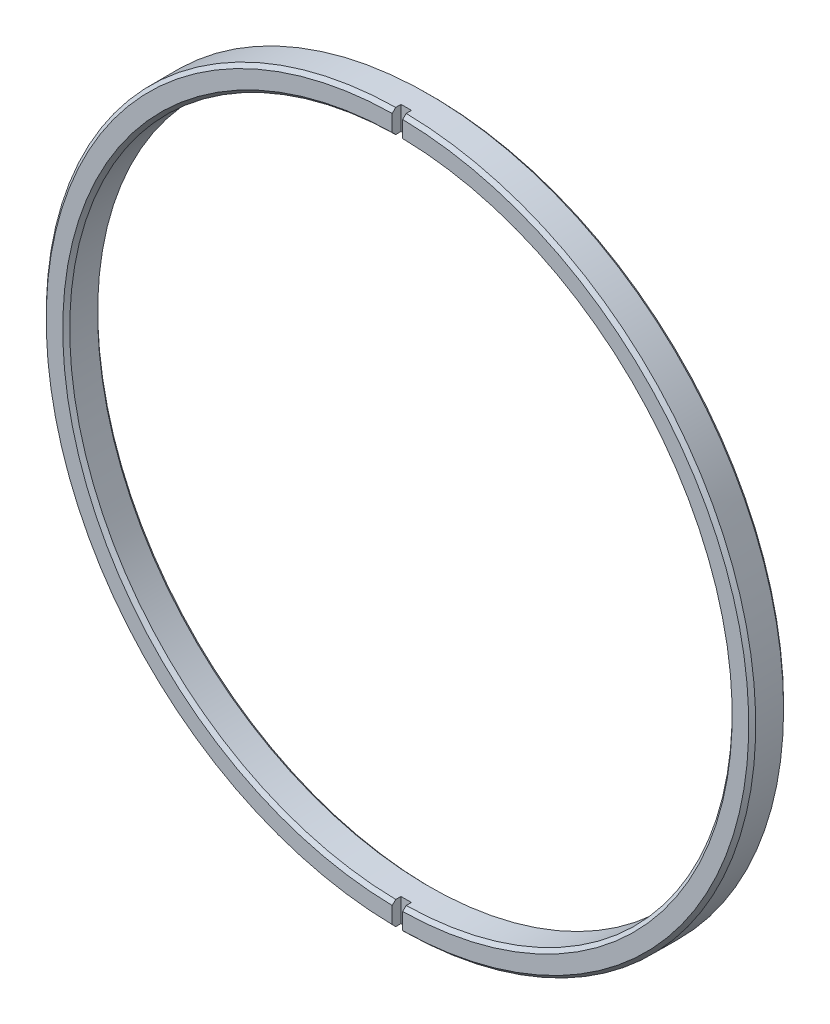
ISO-10303-21;
HEADER;
FILE_DESCRIPTION(('STEP AP214'),'2;1');
FILE_NAME('part.step','',(''),(''),'','','');
FILE_SCHEMA(('AUTOMOTIVE_DESIGN { 1 0 10303 214 1 1 1 1 }'));
ENDSEC;
DATA;
#1=APPLICATION_CONTEXT('core data for automotive mechanical design processes');
#2=APPLICATION_PROTOCOL_DEFINITION('international standard','automotive_design',2000,#1);
#3=PRODUCT_CONTEXT('',#1,'mechanical');
#4=PRODUCT('Part','Part','',(#3));
#5=PRODUCT_RELATED_PRODUCT_CATEGORY('part','',(#4));
#6=PRODUCT_DEFINITION_FORMATION('','',#4);
#7=PRODUCT_DEFINITION_CONTEXT('part definition',#1,'design');
#8=PRODUCT_DEFINITION('design','',#6,#7);
#9=PRODUCT_DEFINITION_SHAPE('','',#8);
#10=(LENGTH_UNIT() NAMED_UNIT(*) SI_UNIT(.MILLI.,.METRE.));
#11=(NAMED_UNIT(*) PLANE_ANGLE_UNIT() SI_UNIT($,.RADIAN.));
#12=(NAMED_UNIT(*) SI_UNIT($,.STERADIAN.) SOLID_ANGLE_UNIT());
#13=UNCERTAINTY_MEASURE_WITH_UNIT(LENGTH_MEASURE(1.E-05),#10,'distance_accuracy_value','');
#14=(GEOMETRIC_REPRESENTATION_CONTEXT(3) GLOBAL_UNCERTAINTY_ASSIGNED_CONTEXT((#13)) GLOBAL_UNIT_ASSIGNED_CONTEXT((#10,
#11,#12)) REPRESENTATION_CONTEXT('',''));
#15=CARTESIAN_POINT('',(0.,0.,0.));
#16=DIRECTION('',(0.,0.,1.));
#17=DIRECTION('',(1.,0.,0.));
#18=AXIS2_PLACEMENT_3D('',#15,#16,#17);
#19=CARTESIAN_POINT('',(-93.4110504351793,-0.249410269873351,50.7311838564651));
#20=DIRECTION('',(0.,0.,1.));
#21=DIRECTION('',(1.,0.,0.));
#22=AXIS2_PLACEMENT_3D('',#19,#20,#21);
#23=PLANE('',#22);
#24=DIRECTION('',(0.,-1.,0.));
#25=VECTOR('',#24,1.);
#26=CARTESIAN_POINT('',(-93.7920504351793,28.4818278532366,50.7311838564651));
#27=LINE('',#26,#25);
#28=CARTESIAN_POINT('',(-93.7920504351793,-24.6304335256762,50.7311838564651));
#29=VERTEX_POINT('',#28);
#30=CARTESIAN_POINT('',(-93.7920504351793,-25.8370738843967,50.7311838564651));
#31=VERTEX_POINT('',#30);
#32=EDGE_CURVE('E270',#29,#31,#27,.T.);
#33=ORIENTED_EDGE('',*,*,#32,.F.);
#34=CARTESIAN_POINT('',(-93.4110504351793,-0.249410269873351,50.7311838564651));
#35=DIRECTION('',(0.,0.,1.));
#36=DIRECTION('',(1.,0.,0.));
#37=AXIS2_PLACEMENT_3D('',#34,#35,#36);
#38=CIRCLE('',#37,24.384);
#39=CARTESIAN_POINT('',(-93.7920504351793,24.1316129859295,50.7311838564651));
#40=VERTEX_POINT('',#39);
#41=EDGE_CURVE('E223',#29,#40,#38,.F.);
#42=ORIENTED_EDGE('',*,*,#41,.T.);
#43=CARTESIAN_POINT('',(-93.7920504351793,25.33825334465,50.7311838564651));
#44=VERTEX_POINT('',#43);
#45=EDGE_CURVE('E269',#44,#40,#27,.T.);
#46=ORIENTED_EDGE('',*,*,#45,.F.);
#47=CARTESIAN_POINT('',(-93.4110504351793,-0.249410269873351,50.7311838564651));
#48=DIRECTION('',(0.,0.,1.));
#49=DIRECTION('',(1.,0.,0.));
#50=AXIS2_PLACEMENT_3D('',#47,#48,#49);
#51=CIRCLE('',#50,25.5905);
#52=EDGE_CURVE('E280',#44,#31,#51,.T.);
#53=ORIENTED_EDGE('',*,*,#52,.T.);
#54=EDGE_LOOP('',(#33,#42,#46,#53));
#55=FACE_BOUND('',#54,.T.);
#56=ADVANCED_FACE('F15',(#55),#23,.T.);
#57=DIRECTION('',(0.,1.,0.));
#58=VECTOR('',#57,1.);
#59=CARTESIAN_POINT('',(-93.0300504351793,28.4818278532366,50.7311838564651));
#60=LINE('',#59,#58);
#61=CARTESIAN_POINT('',(-93.0300504351793,24.1316129859295,50.7311838564651));
#62=VERTEX_POINT('',#61);
#63=CARTESIAN_POINT('',(-93.0300504351793,25.33825334465,50.7311838564651));
#64=VERTEX_POINT('',#63);
#65=EDGE_CURVE('E266',#62,#64,#60,.T.);
#66=ORIENTED_EDGE('',*,*,#65,.F.);
#67=CARTESIAN_POINT('',(-93.4110504351793,-0.249410269873351,50.7311838564651));
#68=DIRECTION('',(0.,0.,1.));
#69=DIRECTION('',(1.,0.,0.));
#70=AXIS2_PLACEMENT_3D('',#67,#68,#69);
#71=CIRCLE('',#70,24.384);
#72=CARTESIAN_POINT('',(-93.0300504351793,-24.6304335256762,50.7311838564651));
#73=VERTEX_POINT('',#72);
#74=EDGE_CURVE('E37',#62,#73,#71,.F.);
#75=ORIENTED_EDGE('',*,*,#74,.T.);
#76=CARTESIAN_POINT('',(-93.0300504351793,-25.8370738843967,50.7311838564651));
#77=VERTEX_POINT('',#76);
#78=EDGE_CURVE('E145',#77,#73,#60,.T.);
#79=ORIENTED_EDGE('',*,*,#78,.F.);
#80=CARTESIAN_POINT('',(-93.4110504351793,-0.249410269873351,50.7311838564651));
#81=DIRECTION('',(0.,0.,1.));
#82=DIRECTION('',(1.,0.,0.));
#83=AXIS2_PLACEMENT_3D('',#80,#81,#82);
#84=CIRCLE('',#83,25.5905);
#85=EDGE_CURVE('E256',#77,#64,#84,.T.);
#86=ORIENTED_EDGE('',*,*,#85,.T.);
#87=EDGE_LOOP('',(#66,#75,#79,#86));
#88=FACE_BOUND('',#87,.T.);
#89=ADVANCED_FACE('F265',(#88),#23,.T.);
#90=CARTESIAN_POINT('',(-93.4110504351793,-0.249410269873351,48.1911838564651));
#91=DIRECTION('',(0.,0.,1.));
#92=DIRECTION('',(1.,0.,0.));
#93=AXIS2_PLACEMENT_3D('',#90,#91,#92);
#94=PLANE('',#93);
#95=CARTESIAN_POINT('',(-93.4110504351793,-0.249410269873351,48.1911838564651));
#96=DIRECTION('',(0.,0.,1.));
#97=DIRECTION('',(1.,0.,0.));
#98=AXIS2_PLACEMENT_3D('',#95,#96,#97);
#99=CIRCLE('',#98,24.384);
#100=CARTESIAN_POINT('',(-69.0270504351793,-0.249410269873351,48.1911838564651));
#101=VERTEX_POINT('',#100);
#102=EDGE_CURVE('E169',#101,#101,#99,.T.);
#103=ORIENTED_EDGE('',*,*,#102,.T.);
#104=EDGE_LOOP('',(#103));
#105=FACE_BOUND('',#104,.T.);
#106=CARTESIAN_POINT('',(-93.4110504351793,-0.249410269873351,48.1911838564651));
#107=DIRECTION('',(0.,0.,1.));
#108=DIRECTION('',(1.,0.,0.));
#109=AXIS2_PLACEMENT_3D('',#106,#107,#108);
#110=CIRCLE('',#109,25.5905);
#111=CARTESIAN_POINT('',(-67.8205504351793,-0.249410269873351,48.1911838564651));
#112=VERTEX_POINT('',#111);
#113=EDGE_CURVE('E166',#112,#112,#110,.F.);
#114=ORIENTED_EDGE('',*,*,#113,.T.);
#115=EDGE_LOOP('',(#114));
#116=FACE_BOUND('',#115,.T.);
#117=ADVANCED_FACE('F297',(#105,#116),#94,.F.);
#118=CARTESIAN_POINT('',(-93.4110504351793,-0.249410269873351,50.7311838564651));
#119=DIRECTION('',(0.,0.,-1.));
#120=DIRECTION('',(-1.,0.,0.));
#121=AXIS2_PLACEMENT_3D('',#118,#119,#120);
#122=CYLINDRICAL_SURFACE('',#121,25.8445);
#123=CARTESIAN_POINT('',(-93.4110504351793,-0.249410269873351,48.4451838564651));
#124=DIRECTION('',(0.,0.,1.));
#125=DIRECTION('',(1.,0.,0.));
#126=AXIS2_PLACEMENT_3D('',#123,#124,#125);
#127=CIRCLE('',#126,25.8445);
#128=CARTESIAN_POINT('',(-67.5665504351793,-0.249410269873351,48.4451838564651));
#129=VERTEX_POINT('',#128);
#130=EDGE_CURVE('E184',#129,#129,#127,.T.);
#131=ORIENTED_EDGE('',*,*,#130,.T.);
#132=EDGE_LOOP('',(#131));
#133=FACE_BOUND('',#132,.T.);
#134=DIRECTION('',(0.,0.,-1.));
#135=VECTOR('',#134,1.);
#136=CARTESIAN_POINT('',(-93.0300504351793,25.5922812237189,50.7311838564651));
#137=LINE('',#136,#135);
#138=CARTESIAN_POINT('',(-93.0300504351793,25.5922812237189,50.0961838564651));
#139=VERTEX_POINT('',#138);
#140=CARTESIAN_POINT('',(-93.0300504351793,25.5922812237189,50.4771838564652));
#141=VERTEX_POINT('',#140);
#142=EDGE_CURVE('E133',#139,#141,#137,.F.);
#143=ORIENTED_EDGE('',*,*,#142,.T.);
#144=CARTESIAN_POINT('',(-93.4110504351793,-0.249410269873351,50.4771838564652));
#145=DIRECTION('',(0.,0.,1.));
#146=DIRECTION('',(1.,0.,0.));
#147=AXIS2_PLACEMENT_3D('',#144,#145,#146);
#148=CIRCLE('',#147,25.8445);
#149=CARTESIAN_POINT('',(-93.0300504351793,-26.0911017634656,50.4771838564652));
#150=VERTEX_POINT('',#149);
#151=EDGE_CURVE('E182',#141,#150,#148,.F.);
#152=ORIENTED_EDGE('',*,*,#151,.T.);
#153=DIRECTION('',(0.,0.,-1.));
#154=VECTOR('',#153,1.);
#155=CARTESIAN_POINT('',(-93.0300504351793,-26.0911017634656,50.7311838564651));
#156=LINE('',#155,#154);
#157=CARTESIAN_POINT('',(-93.0300504351793,-26.0911017634656,50.0961838564651));
#158=VERTEX_POINT('',#157);
#159=EDGE_CURVE('E151',#150,#158,#156,.T.);
#160=ORIENTED_EDGE('',*,*,#159,.T.);
#161=CARTESIAN_POINT('',(-93.4110504351793,-0.249410269873351,50.0961838564651));
#162=DIRECTION('',(0.,0.,1.));
#163=DIRECTION('',(1.,0.,0.));
#164=AXIS2_PLACEMENT_3D('',#161,#162,#163);
#165=CIRCLE('',#164,25.8445);
#166=CARTESIAN_POINT('',(-93.7920504351793,-26.0911017634656,50.0961838564651));
#167=VERTEX_POINT('',#166);
#168=EDGE_CURVE('E134',#167,#158,#165,.T.);
#169=ORIENTED_EDGE('',*,*,#168,.F.);
#170=DIRECTION('',(0.,0.,-1.));
#171=VECTOR('',#170,1.);
#172=CARTESIAN_POINT('',(-93.7920504351793,-26.0911017634656,50.7311838564651));
#173=LINE('',#172,#171);
#174=CARTESIAN_POINT('',(-93.7920504351793,-26.0911017634656,50.4771838564652));
#175=VERTEX_POINT('',#174);
#176=EDGE_CURVE('E123',#167,#175,#173,.F.);
#177=ORIENTED_EDGE('',*,*,#176,.T.);
#178=CARTESIAN_POINT('',(-93.4110504351793,-0.249410269873351,50.4771838564652));
#179=DIRECTION('',(0.,0.,1.));
#180=DIRECTION('',(1.,0.,0.));
#181=AXIS2_PLACEMENT_3D('',#178,#179,#180);
#182=CIRCLE('',#181,25.8445);
#183=CARTESIAN_POINT('',(-93.7920504351793,25.5922812237189,50.4771838564652));
#184=VERTEX_POINT('',#183);
#185=EDGE_CURVE('E118',#175,#184,#182,.F.);
#186=ORIENTED_EDGE('',*,*,#185,.T.);
#187=DIRECTION('',(0.,0.,-1.));
#188=VECTOR('',#187,1.);
#189=CARTESIAN_POINT('',(-93.7920504351793,25.5922812237189,50.7311838564651));
#190=LINE('',#189,#188);
#191=CARTESIAN_POINT('',(-93.7920504351793,25.5922812237189,50.0961838564651));
#192=VERTEX_POINT('',#191);
#193=EDGE_CURVE('E111',#184,#192,#190,.T.);
#194=ORIENTED_EDGE('',*,*,#193,.T.);
#195=EDGE_CURVE('E115',#139,#192,#165,.T.);
#196=ORIENTED_EDGE('',*,*,#195,.F.);
#197=EDGE_LOOP('',(#143,#152,#160,#169,#177,#186,#194,#196));
#198=FACE_BOUND('',#197,.T.);
#199=ADVANCED_FACE('F114',(#133,#198),#122,.T.);
#200=CARTESIAN_POINT('',(-93.4110504351793,-0.249410269873351,50.7311838564651));
#201=DIRECTION('',(0.,0.,-1.));
#202=DIRECTION('',(-1.,0.,0.));
#203=AXIS2_PLACEMENT_3D('',#200,#201,#202);
#204=CYLINDRICAL_SURFACE('',#203,24.13);
#205=CARTESIAN_POINT('',(-93.4110504351793,-0.249410269873351,48.4451838564651));
#206=DIRECTION('',(0.,0.,1.));
#207=DIRECTION('',(1.,0.,0.));
#208=AXIS2_PLACEMENT_3D('',#205,#206,#207);
#209=CIRCLE('',#208,24.13);
#210=CARTESIAN_POINT('',(-69.2810504351793,-0.249410269873351,48.4451838564651));
#211=VERTEX_POINT('',#210);
#212=EDGE_CURVE('E178',#211,#211,#209,.F.);
#213=ORIENTED_EDGE('',*,*,#212,.T.);
#214=EDGE_LOOP('',(#213));
#215=FACE_BOUND('',#214,.T.);
#216=DIRECTION('',(0.,0.,-1.));
#217=VECTOR('',#216,1.);
#218=CARTESIAN_POINT('',(-93.7920504351793,23.8775816478938,50.7311838564651));
#219=LINE('',#218,#217);
#220=CARTESIAN_POINT('',(-93.7920504351793,23.8775816478938,50.4771838564651));
#221=VERTEX_POINT('',#220);
#222=CARTESIAN_POINT('',(-93.7920504351793,23.8775816478938,50.0961838564651));
#223=VERTEX_POINT('',#222);
#224=EDGE_CURVE('E139',#221,#223,#219,.T.);
#225=ORIENTED_EDGE('',*,*,#224,.F.);
#226=CARTESIAN_POINT('',(-93.4110504351793,-0.249410269873351,50.4771838564651));
#227=DIRECTION('',(0.,0.,1.));
#228=DIRECTION('',(1.,0.,0.));
#229=AXIS2_PLACEMENT_3D('',#226,#227,#228);
#230=CIRCLE('',#229,24.13);
#231=CARTESIAN_POINT('',(-93.7920504351793,-24.3764021876405,50.4771838564651));
#232=VERTEX_POINT('',#231);
#233=EDGE_CURVE('E175',#221,#232,#230,.T.);
#234=ORIENTED_EDGE('',*,*,#233,.T.);
#235=DIRECTION('',(0.,0.,-1.));
#236=VECTOR('',#235,1.);
#237=CARTESIAN_POINT('',(-93.7920504351793,-24.3764021876405,50.7311838564651));
#238=LINE('',#237,#236);
#239=CARTESIAN_POINT('',(-93.7920504351793,-24.3764021876405,50.0961838564651));
#240=VERTEX_POINT('',#239);
#241=EDGE_CURVE('E159',#240,#232,#238,.F.);
#242=ORIENTED_EDGE('',*,*,#241,.F.);
#243=CARTESIAN_POINT('',(-93.4110504351793,-0.249410269873351,50.0961838564651));
#244=DIRECTION('',(0.,0.,1.));
#245=DIRECTION('',(1.,0.,0.));
#246=AXIS2_PLACEMENT_3D('',#243,#244,#245);
#247=CIRCLE('',#246,24.13);
#248=CARTESIAN_POINT('',(-93.0300504351793,-24.3764021876405,50.0961838564651));
#249=VERTEX_POINT('',#248);
#250=EDGE_CURVE('E122',#240,#249,#247,.T.);
#251=ORIENTED_EDGE('',*,*,#250,.T.);
#252=DIRECTION('',(0.,0.,-1.));
#253=VECTOR('',#252,1.);
#254=CARTESIAN_POINT('',(-93.0300504351793,-24.3764021876405,50.7311838564651));
#255=LINE('',#254,#253);
#256=CARTESIAN_POINT('',(-93.0300504351793,-24.3764021876405,50.4771838564651));
#257=VERTEX_POINT('',#256);
#258=EDGE_CURVE('E156',#257,#249,#255,.T.);
#259=ORIENTED_EDGE('',*,*,#258,.F.);
#260=CARTESIAN_POINT('',(-93.4110504351793,-0.249410269873351,50.4771838564651));
#261=DIRECTION('',(0.,0.,1.));
#262=DIRECTION('',(1.,0.,0.));
#263=AXIS2_PLACEMENT_3D('',#260,#261,#262);
#264=CIRCLE('',#263,24.13);
#265=CARTESIAN_POINT('',(-93.0300504351793,23.8775816478938,50.4771838564651));
#266=VERTEX_POINT('',#265);
#267=EDGE_CURVE('E172',#257,#266,#264,.T.);
#268=ORIENTED_EDGE('',*,*,#267,.T.);
#269=DIRECTION('',(0.,0.,-1.));
#270=VECTOR('',#269,1.);
#271=CARTESIAN_POINT('',(-93.0300504351793,23.8775816478938,50.7311838564651));
#272=LINE('',#271,#270);
#273=CARTESIAN_POINT('',(-93.0300504351793,23.8775816478938,50.0961838564651));
#274=VERTEX_POINT('',#273);
#275=EDGE_CURVE('E162',#274,#266,#272,.F.);
#276=ORIENTED_EDGE('',*,*,#275,.F.);
#277=EDGE_CURVE('E157',#274,#223,#247,.T.);
#278=ORIENTED_EDGE('',*,*,#277,.T.);
#279=EDGE_LOOP('',(#225,#234,#242,#251,#259,#268,#276,#278));
#280=FACE_BOUND('',#279,.T.);
#281=ADVANCED_FACE('F209',(#215,#280),#204,.F.);
#282=CARTESIAN_POINT('',(-93.7920504351793,-30.2378711679971,50.0961838564651));
#283=DIRECTION('',(0.,0.,1.));
#284=DIRECTION('',(1.,0.,0.));
#285=AXIS2_PLACEMENT_3D('',#282,#283,#284);
#286=PLANE('',#285);
#287=ORIENTED_EDGE('',*,*,#168,.T.);
#288=DIRECTION('',(0.,1.,0.));
#289=VECTOR('',#288,1.);
#290=CARTESIAN_POINT('',(-93.0300504351793,28.4818278532366,50.0961838564651));
#291=LINE('',#290,#289);
#292=EDGE_CURVE('E142',#158,#249,#291,.T.);
#293=ORIENTED_EDGE('',*,*,#292,.T.);
#294=ORIENTED_EDGE('',*,*,#250,.F.);
#295=DIRECTION('',(0.,-1.,0.));
#296=VECTOR('',#295,1.);
#297=CARTESIAN_POINT('',(-93.7920504351793,28.4818278532366,50.0961838564651));
#298=LINE('',#297,#296);
#299=EDGE_CURVE('E140',#240,#167,#298,.T.);
#300=ORIENTED_EDGE('',*,*,#299,.T.);
#301=EDGE_LOOP('',(#287,#293,#294,#300));
#302=FACE_BOUND('',#301,.T.);
#303=ADVANCED_FACE('F309',(#302),#286,.T.);
#304=CARTESIAN_POINT('',(-93.0300504351793,28.4818278532366,50.0961838564651));
#305=DIRECTION('',(1.,0.,0.));
#306=DIRECTION('',(0.,1.,0.));
#307=AXIS2_PLACEMENT_3D('',#304,#305,#306);
#308=PLANE('',#307);
#309=ORIENTED_EDGE('',*,*,#78,.T.);
#310=CARTESIAN_POINT('',(-93.0300504351793,-24.6304335256762,50.7311838564651));
#311=CARTESIAN_POINT('',(-93.0300504351793,-24.5880949966842,50.6888504957812));
#312=CARTESIAN_POINT('',(-93.0300504351793,-24.5457564540185,50.6465171487725));
#313=CARTESIAN_POINT('',(-93.0300504351793,-24.46107934134,50.5618504821058));
#314=CARTESIAN_POINT('',(-93.0300504351793,-24.418740771327,50.5195171624478));
#315=CARTESIAN_POINT('',(-93.0300504351793,-24.3764021876405,50.4771838564651));
#316=B_SPLINE_CURVE_WITH_KNOTS('',3,(#310,#311,#312,#313,#314,#315),.UNSPECIFIED.,.F.,.F.,(4,2,
4),(0.,0.179616202431916,0.359232404863831),.UNSPECIFIED.);
#317=EDGE_CURVE('E10',#73,#257,#316,.T.);
#318=ORIENTED_EDGE('',*,*,#317,.T.);
#319=ORIENTED_EDGE('',*,*,#258,.T.);
#320=ORIENTED_EDGE('',*,*,#292,.F.);
#321=ORIENTED_EDGE('',*,*,#159,.F.);
#322=CARTESIAN_POINT('',(-93.0300504351793,-26.0911017634656,50.4771838564652));
#323=CARTESIAN_POINT('',(-93.0300504351793,-26.0487638065678,50.519517212748));
#324=CARTESIAN_POINT('',(-93.0300504351793,-26.0064258381965,50.5618505575561));
#325=CARTESIAN_POINT('',(-93.0300504351793,-25.9217498785068,50.6465172242227));
#326=CARTESIAN_POINT('',(-93.0300504351793,-25.8794118871885,50.6888505460813));
#327=CARTESIAN_POINT('',(-93.0300504351793,-25.8370738843967,50.7311838564651));
#328=B_SPLINE_CURVE_WITH_KNOTS('',3,(#322,#323,#324,#325,#326,#327),.UNSPECIFIED.,.F.,.F.,(4,2,
4),(0.,0.179614979431201,0.359229958862404),.UNSPECIFIED.);
#329=EDGE_CURVE('E30',#150,#77,#328,.T.);
#330=ORIENTED_EDGE('',*,*,#329,.T.);
#331=EDGE_LOOP('',(#309,#318,#319,#320,#321,#330));
#332=FACE_BOUND('',#331,.T.);
#333=ADVANCED_FACE('F206',(#332),#308,.F.);
#334=CARTESIAN_POINT('',(-93.7920504351793,28.4818278532366,50.0961838564651));
#335=DIRECTION('',(-1.,0.,0.));
#336=DIRECTION('',(0.,-1.,0.));
#337=AXIS2_PLACEMENT_3D('',#334,#335,#336);
#338=PLANE('',#337);
#339=ORIENTED_EDGE('',*,*,#241,.T.);
#340=CARTESIAN_POINT('',(-93.7920504351793,-24.3764021876405,50.4771838564651));
#341=CARTESIAN_POINT('',(-93.7920504351793,-24.418740771327,50.5195171624478));
#342=CARTESIAN_POINT('',(-93.7920504351793,-24.46107934134,50.5618504821058));
#343=CARTESIAN_POINT('',(-93.7920504351793,-24.5457564540185,50.6465171487725));
#344=CARTESIAN_POINT('',(-93.7920504351793,-24.5880949966842,50.6888504957812));
#345=CARTESIAN_POINT('',(-93.7920504351793,-24.6304335256762,50.7311838564651));
#346=B_SPLINE_CURVE_WITH_KNOTS('',3,(#340,#341,#342,#343,#344,#345),.UNSPECIFIED.,.F.,.F.,(4,2,
4),(0.,0.179616202431912,0.359232404863828),.UNSPECIFIED.);
#347=EDGE_CURVE('E194',#232,#29,#346,.T.);
#348=ORIENTED_EDGE('',*,*,#347,.T.);
#349=ORIENTED_EDGE('',*,*,#32,.T.);
#350=CARTESIAN_POINT('',(-93.7920504351793,-25.8370738843967,50.7311838564651));
#351=CARTESIAN_POINT('',(-93.7920504351793,-25.8794118871885,50.6888505460813));
#352=CARTESIAN_POINT('',(-93.7920504351793,-25.9217498785068,50.6465172242227));
#353=CARTESIAN_POINT('',(-93.7920504351793,-26.0064258381965,50.5618505575561));
#354=CARTESIAN_POINT('',(-93.7920504351793,-26.0487638065678,50.519517212748));
#355=CARTESIAN_POINT('',(-93.7920504351793,-26.0911017634656,50.4771838564652));
#356=B_SPLINE_CURVE_WITH_KNOTS('',3,(#350,#351,#352,#353,#354,#355),.UNSPECIFIED.,.F.,.F.,(4,2,
4),(0.,0.179614979431203,0.359229958862401),.UNSPECIFIED.);
#357=EDGE_CURVE('E187',#31,#175,#356,.T.);
#358=ORIENTED_EDGE('',*,*,#357,.T.);
#359=ORIENTED_EDGE('',*,*,#176,.F.);
#360=ORIENTED_EDGE('',*,*,#299,.F.);
#361=EDGE_LOOP('',(#339,#348,#349,#358,#359,#360));
#362=FACE_BOUND('',#361,.T.);
#363=ADVANCED_FACE('F205',(#362),#338,.F.);
#364=ORIENTED_EDGE('',*,*,#45,.T.);
#365=CARTESIAN_POINT('',(-93.7920504351793,24.1316129859295,50.7311838564651));
#366=CARTESIAN_POINT('',(-93.7920504351793,24.0892744569375,50.6888504957812));
#367=CARTESIAN_POINT('',(-93.7920504351793,24.0469359142718,50.6465171487725));
#368=CARTESIAN_POINT('',(-93.7920504351793,23.9622588015933,50.5618504821058));
#369=CARTESIAN_POINT('',(-93.7920504351793,23.9199202315803,50.5195171624478));
#370=CARTESIAN_POINT('',(-93.7920504351793,23.8775816478938,50.4771838564651));
#371=B_SPLINE_CURVE_WITH_KNOTS('',3,(#365,#366,#367,#368,#369,#370),.UNSPECIFIED.,.F.,.F.,(4,2,
4),(0.,0.179616202431916,0.359232404863831),.UNSPECIFIED.);
#372=EDGE_CURVE('E222',#40,#221,#371,.T.);
#373=ORIENTED_EDGE('',*,*,#372,.T.);
#374=ORIENTED_EDGE('',*,*,#224,.T.);
#375=EDGE_CURVE('E129',#192,#223,#298,.T.);
#376=ORIENTED_EDGE('',*,*,#375,.F.);
#377=ORIENTED_EDGE('',*,*,#193,.F.);
#378=CARTESIAN_POINT('',(-93.7920504351793,25.5922812237189,50.4771838564652));
#379=CARTESIAN_POINT('',(-93.7920504351793,25.5499432668211,50.519517212748));
#380=CARTESIAN_POINT('',(-93.7920504351793,25.5076052984498,50.5618505575561));
#381=CARTESIAN_POINT('',(-93.7920504351793,25.4229293387601,50.6465172242227));
#382=CARTESIAN_POINT('',(-93.7920504351793,25.3805913474418,50.6888505460813));
#383=CARTESIAN_POINT('',(-93.7920504351793,25.33825334465,50.7311838564651));
#384=B_SPLINE_CURVE_WITH_KNOTS('',3,(#378,#379,#380,#381,#382,#383),.UNSPECIFIED.,.F.,.F.,(4,2,
4),(0.,0.179614979431201,0.359229958862404),.UNSPECIFIED.);
#385=EDGE_CURVE('E216',#184,#44,#384,.T.);
#386=ORIENTED_EDGE('',*,*,#385,.T.);
#387=EDGE_LOOP('',(#364,#373,#374,#376,#377,#386));
#388=FACE_BOUND('',#387,.T.);
#389=ADVANCED_FACE('F137',(#388),#338,.F.);
#390=ORIENTED_EDGE('',*,*,#275,.T.);
#391=CARTESIAN_POINT('',(-93.0300504351793,23.8775816478938,50.4771838564651));
#392=CARTESIAN_POINT('',(-93.0300504351793,23.9199202315803,50.5195171624478));
#393=CARTESIAN_POINT('',(-93.0300504351793,23.9622588015933,50.5618504821058));
#394=CARTESIAN_POINT('',(-93.0300504351793,24.0469359142718,50.6465171487725));
#395=CARTESIAN_POINT('',(-93.0300504351793,24.0892744569375,50.6888504957812));
#396=CARTESIAN_POINT('',(-93.0300504351793,24.1316129859295,50.7311838564651));
#397=B_SPLINE_CURVE_WITH_KNOTS('',3,(#391,#392,#393,#394,#395,#396),.UNSPECIFIED.,.F.,.F.,(4,2,
4),(0.,0.179616202431912,0.359232404863828),.UNSPECIFIED.);
#398=EDGE_CURVE('E250',#266,#62,#397,.T.);
#399=ORIENTED_EDGE('',*,*,#398,.T.);
#400=ORIENTED_EDGE('',*,*,#65,.T.);
#401=CARTESIAN_POINT('',(-93.0300504351793,25.33825334465,50.7311838564651));
#402=CARTESIAN_POINT('',(-93.0300504351793,25.3805913474418,50.6888505460813));
#403=CARTESIAN_POINT('',(-93.0300504351793,25.4229293387601,50.6465172242227));
#404=CARTESIAN_POINT('',(-93.0300504351793,25.5076052984498,50.5618505575561));
#405=CARTESIAN_POINT('',(-93.0300504351793,25.5499432668211,50.519517212748));
#406=CARTESIAN_POINT('',(-93.0300504351793,25.5922812237189,50.4771838564652));
#407=B_SPLINE_CURVE_WITH_KNOTS('',3,(#401,#402,#403,#404,#405,#406),.UNSPECIFIED.,.F.,.F.,(4,2,
4),(0.,0.179614979431203,0.359229958862401),.UNSPECIFIED.);
#408=EDGE_CURVE('E229',#64,#141,#407,.T.);
#409=ORIENTED_EDGE('',*,*,#408,.T.);
#410=ORIENTED_EDGE('',*,*,#142,.F.);
#411=EDGE_CURVE('E132',#274,#139,#291,.T.);
#412=ORIENTED_EDGE('',*,*,#411,.F.);
#413=EDGE_LOOP('',(#390,#399,#400,#409,#410,#412));
#414=FACE_BOUND('',#413,.T.);
#415=ADVANCED_FACE('F204',(#414),#308,.F.);
#416=ORIENTED_EDGE('',*,*,#195,.T.);
#417=ORIENTED_EDGE('',*,*,#375,.T.);
#418=ORIENTED_EDGE('',*,*,#277,.F.);
#419=ORIENTED_EDGE('',*,*,#411,.T.);
#420=EDGE_LOOP('',(#416,#417,#418,#419));
#421=FACE_BOUND('',#420,.T.);
#422=ADVANCED_FACE('F128',(#421),#286,.T.);
#423=CARTESIAN_POINT('',(-93.4110504351793,-0.249410269873351,48.1911838564651));
#424=DIRECTION('',(0.,0.,-1.));
#425=DIRECTION('',(-1.,0.,0.));
#426=AXIS2_PLACEMENT_3D('',#423,#424,#425);
#427=CONICAL_SURFACE('',#426,24.384,0.785398163397448);
#428=ORIENTED_EDGE('',*,*,#212,.F.);
#429=EDGE_LOOP('',(#428));
#430=FACE_BOUND('',#429,.T.);
#431=ORIENTED_EDGE('',*,*,#102,.F.);
#432=EDGE_LOOP('',(#431));
#433=FACE_BOUND('',#432,.T.);
#434=ADVANCED_FACE('F301',(#430,#433),#427,.F.);
#435=CARTESIAN_POINT('',(-93.4110504351793,-0.249410269873351,48.4451838564651));
#436=DIRECTION('',(0.,0.,1.));
#437=DIRECTION('',(1.,0.,0.));
#438=AXIS2_PLACEMENT_3D('',#435,#436,#437);
#439=CONICAL_SURFACE('',#438,25.8445,0.785398163397435);
#440=ORIENTED_EDGE('',*,*,#113,.F.);
#441=EDGE_LOOP('',(#440));
#442=FACE_BOUND('',#441,.T.);
#443=ORIENTED_EDGE('',*,*,#130,.F.);
#444=EDGE_LOOP('',(#443));
#445=FACE_BOUND('',#444,.T.);
#446=ADVANCED_FACE('F240',(#442,#445),#439,.T.);
#447=CARTESIAN_POINT('',(-93.4110504351793,-0.249410269873351,50.4771838564651));
#448=DIRECTION('',(0.,0.,1.));
#449=DIRECTION('',(1.,0.,0.));
#450=AXIS2_PLACEMENT_3D('',#447,#448,#449);
#451=CONICAL_SURFACE('',#450,24.13,0.785398163397442);
#452=ORIENTED_EDGE('',*,*,#372,.F.);
#453=ORIENTED_EDGE('',*,*,#41,.F.);
#454=ORIENTED_EDGE('',*,*,#347,.F.);
#455=ORIENTED_EDGE('',*,*,#233,.F.);
#456=EDGE_LOOP('',(#452,#453,#454,#455));
#457=FACE_BOUND('',#456,.T.);
#458=ADVANCED_FACE('F235',(#457),#451,.F.);
#459=CARTESIAN_POINT('',(-93.4110504351793,-0.249410269873351,50.4771838564651));
#460=DIRECTION('',(0.,0.,1.));
#461=DIRECTION('',(1.,0.,0.));
#462=AXIS2_PLACEMENT_3D('',#459,#460,#461);
#463=CONICAL_SURFACE('',#462,24.13,0.785398163397442);
#464=ORIENTED_EDGE('',*,*,#317,.F.);
#465=ORIENTED_EDGE('',*,*,#74,.F.);
#466=ORIENTED_EDGE('',*,*,#398,.F.);
#467=ORIENTED_EDGE('',*,*,#267,.F.);
#468=EDGE_LOOP('',(#464,#465,#466,#467));
#469=FACE_BOUND('',#468,.T.);
#470=ADVANCED_FACE('F239',(#469),#463,.F.);
#471=CARTESIAN_POINT('',(-93.4110504351793,-0.249410269873351,50.7311838564651));
#472=DIRECTION('',(0.,0.,-1.));
#473=DIRECTION('',(-1.,0.,0.));
#474=AXIS2_PLACEMENT_3D('',#471,#472,#473);
#475=CONICAL_SURFACE('',#474,25.5905,0.785398163397455);
#476=ORIENTED_EDGE('',*,*,#329,.F.);
#477=ORIENTED_EDGE('',*,*,#151,.F.);
#478=ORIENTED_EDGE('',*,*,#408,.F.);
#479=ORIENTED_EDGE('',*,*,#85,.F.);
#480=EDGE_LOOP('',(#476,#477,#478,#479));
#481=FACE_BOUND('',#480,.T.);
#482=ADVANCED_FACE('F246',(#481),#475,.T.);
#483=CARTESIAN_POINT('',(-93.4110504351793,-0.249410269873351,50.7311838564651));
#484=DIRECTION('',(0.,0.,-1.));
#485=DIRECTION('',(-1.,0.,0.));
#486=AXIS2_PLACEMENT_3D('',#483,#484,#485);
#487=CONICAL_SURFACE('',#486,25.5905,0.785398163397455);
#488=ORIENTED_EDGE('',*,*,#385,.F.);
#489=ORIENTED_EDGE('',*,*,#185,.F.);
#490=ORIENTED_EDGE('',*,*,#357,.F.);
#491=ORIENTED_EDGE('',*,*,#52,.F.);
#492=EDGE_LOOP('',(#488,#489,#490,#491));
#493=FACE_BOUND('',#492,.T.);
#494=ADVANCED_FACE('F17',(#493),#487,.T.);
#495=CLOSED_SHELL('',(#56,#89,#117,#199,#281,#303,#333,#363,#389,#415,#422,#434,#446,#458,#470,
#482,#494));
#496=MANIFOLD_SOLID_BREP('B1',#495);
#497=ADVANCED_BREP_SHAPE_REPRESENTATION('',(#18,#496),#14);
#498=SHAPE_DEFINITION_REPRESENTATION(#9,#497);
ENDSEC;
END-ISO-10303-21;
